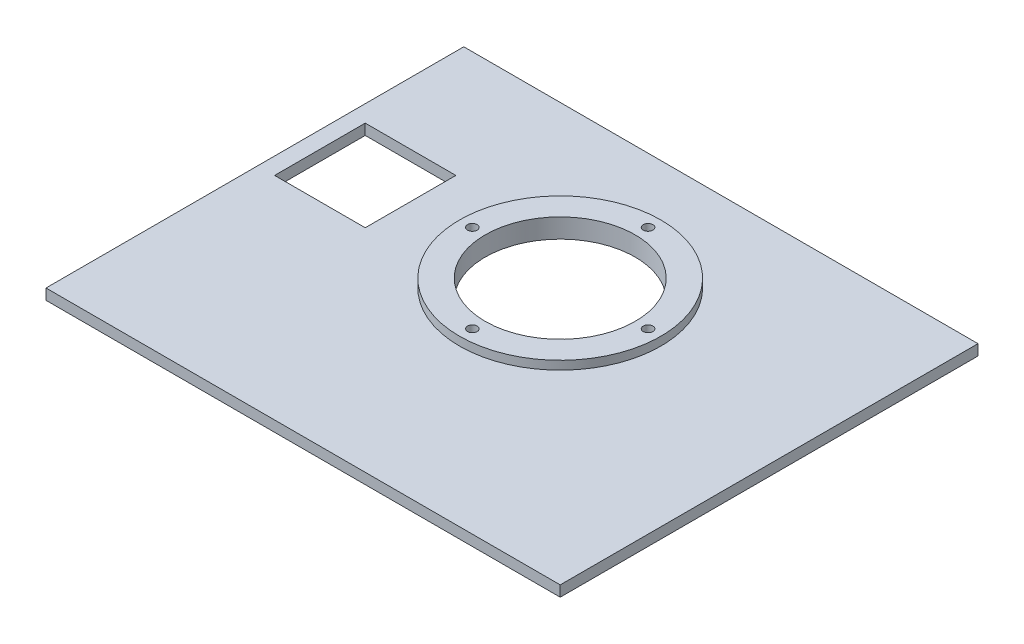
ISO-10303-21;
HEADER;
FILE_DESCRIPTION(('STEP AP214'),'2;1');
FILE_NAME('part.step','',(''),(''),'','','');
FILE_SCHEMA(('AUTOMOTIVE_DESIGN { 1 0 10303 214 1 1 1 1 }'));
ENDSEC;
DATA;
#1=APPLICATION_CONTEXT('core data for automotive mechanical design processes');
#2=APPLICATION_PROTOCOL_DEFINITION('international standard','automotive_design',2000,#1);
#3=PRODUCT_CONTEXT('',#1,'mechanical');
#4=PRODUCT('Part','Part','',(#3));
#5=PRODUCT_RELATED_PRODUCT_CATEGORY('part','',(#4));
#6=PRODUCT_DEFINITION_FORMATION('','',#4);
#7=PRODUCT_DEFINITION_CONTEXT('part definition',#1,'design');
#8=PRODUCT_DEFINITION('design','',#6,#7);
#9=PRODUCT_DEFINITION_SHAPE('','',#8);
#10=(LENGTH_UNIT() NAMED_UNIT(*) SI_UNIT(.MILLI.,.METRE.));
#11=(NAMED_UNIT(*) PLANE_ANGLE_UNIT() SI_UNIT($,.RADIAN.));
#12=(NAMED_UNIT(*) SI_UNIT($,.STERADIAN.) SOLID_ANGLE_UNIT());
#13=UNCERTAINTY_MEASURE_WITH_UNIT(LENGTH_MEASURE(1.E-05),#10,'distance_accuracy_value','');
#14=(GEOMETRIC_REPRESENTATION_CONTEXT(3) GLOBAL_UNCERTAINTY_ASSIGNED_CONTEXT((#13)) GLOBAL_UNIT_ASSIGNED_CONTEXT((#10,
#11,#12)) REPRESENTATION_CONTEXT('',''));
#15=CARTESIAN_POINT('',(0.,0.,0.));
#16=DIRECTION('',(0.,0.,1.));
#17=DIRECTION('',(1.,0.,0.));
#18=AXIS2_PLACEMENT_3D('',#15,#16,#17);
#19=CARTESIAN_POINT('',(0.,0.,0.));
#20=DIRECTION('',(0.,1.,0.));
#21=DIRECTION('',(0.,0.,1.));
#22=AXIS2_PLACEMENT_3D('',#19,#20,#21);
#23=PLANE('',#22);
#24=DIRECTION('',(1.,0.,0.));
#25=VECTOR('',#24,1.);
#26=CARTESIAN_POINT('',(0.,0.,21.15));
#27=LINE('',#26,#25);
#28=CARTESIAN_POINT('',(-112.15,0.,21.15));
#29=VERTEX_POINT('',#28);
#30=CARTESIAN_POINT('',(-69.85,0.,21.15));
#31=VERTEX_POINT('',#30);
#32=EDGE_CURVE('E134',#29,#31,#27,.T.);
#33=ORIENTED_EDGE('',*,*,#32,.T.);
#34=DIRECTION('',(0.,0.,-1.));
#35=VECTOR('',#34,1.);
#36=CARTESIAN_POINT('',(-69.85,0.,0.));
#37=LINE('',#36,#35);
#38=CARTESIAN_POINT('',(-69.85,0.,-21.15));
#39=VERTEX_POINT('',#38);
#40=EDGE_CURVE('E137',#31,#39,#37,.T.);
#41=ORIENTED_EDGE('',*,*,#40,.T.);
#42=DIRECTION('',(-1.,0.,0.));
#43=VECTOR('',#42,1.);
#44=CARTESIAN_POINT('',(0.,0.,-21.15));
#45=LINE('',#44,#43);
#46=CARTESIAN_POINT('',(-112.15,0.,-21.15));
#47=VERTEX_POINT('',#46);
#48=EDGE_CURVE('E129',#39,#47,#45,.T.);
#49=ORIENTED_EDGE('',*,*,#48,.T.);
#50=DIRECTION('',(0.,0.,1.));
#51=VECTOR('',#50,1.);
#52=CARTESIAN_POINT('',(-112.15,0.,0.));
#53=LINE('',#52,#51);
#54=EDGE_CURVE('E109',#47,#29,#53,.T.);
#55=ORIENTED_EDGE('',*,*,#54,.T.);
#56=EDGE_LOOP('',(#33,#41,#49,#55));
#57=FACE_BOUND('',#56,.T.);
#58=CARTESIAN_POINT('',(-41.,0.,0.));
#59=DIRECTION('',(0.,-1.,0.));
#60=DIRECTION('',(0.,0.,-1.));
#61=AXIS2_PLACEMENT_3D('',#58,#59,#60);
#62=CIRCLE('',#61,2.25);
#63=CARTESIAN_POINT('',(-41.,0.,-2.25));
#64=VERTEX_POINT('',#63);
#65=EDGE_CURVE('E143',#64,#64,#62,.T.);
#66=ORIENTED_EDGE('',*,*,#65,.F.);
#67=EDGE_LOOP('',(#66));
#68=FACE_BOUND('',#67,.T.);
#69=CARTESIAN_POINT('',(0.,0.,41.));
#70=DIRECTION('',(0.,-1.,0.));
#71=DIRECTION('',(0.,0.,-1.));
#72=AXIS2_PLACEMENT_3D('',#69,#70,#71);
#73=CIRCLE('',#72,2.25);
#74=CARTESIAN_POINT('',(0.,0.,38.75));
#75=VERTEX_POINT('',#74);
#76=EDGE_CURVE('E147',#75,#75,#73,.T.);
#77=ORIENTED_EDGE('',*,*,#76,.F.);
#78=EDGE_LOOP('',(#77));
#79=FACE_BOUND('',#78,.T.);
#80=CARTESIAN_POINT('',(41.,0.,0.));
#81=DIRECTION('',(0.,-1.,0.));
#82=DIRECTION('',(0.,0.,-1.));
#83=AXIS2_PLACEMENT_3D('',#80,#81,#82);
#84=CIRCLE('',#83,2.25);
#85=CARTESIAN_POINT('',(41.,0.,-2.25));
#86=VERTEX_POINT('',#85);
#87=EDGE_CURVE('E153',#86,#86,#84,.T.);
#88=ORIENTED_EDGE('',*,*,#87,.F.);
#89=EDGE_LOOP('',(#88));
#90=FACE_BOUND('',#89,.T.);
#91=DIRECTION('',(0.,0.,1.));
#92=VECTOR('',#91,1.);
#93=CARTESIAN_POINT('',(-120.,0.,-75.));
#94=LINE('',#93,#92);
#95=CARTESIAN_POINT('',(-120.,0.,-75.));
#96=VERTEX_POINT('',#95);
#97=CARTESIAN_POINT('',(-120.,0.,120.));
#98=VERTEX_POINT('',#97);
#99=EDGE_CURVE('E168',#96,#98,#94,.T.);
#100=ORIENTED_EDGE('',*,*,#99,.F.);
#101=DIRECTION('',(-1.,0.,0.));
#102=VECTOR('',#101,1.);
#103=CARTESIAN_POINT('',(-120.,0.,-75.));
#104=LINE('',#103,#102);
#105=CARTESIAN_POINT('',(120.,0.,-75.));
#106=VERTEX_POINT('',#105);
#107=EDGE_CURVE('E173',#106,#96,#104,.T.);
#108=ORIENTED_EDGE('',*,*,#107,.F.);
#109=DIRECTION('',(0.,0.,-1.));
#110=VECTOR('',#109,1.);
#111=CARTESIAN_POINT('',(120.,0.,120.));
#112=LINE('',#111,#110);
#113=CARTESIAN_POINT('',(120.,0.,120.));
#114=VERTEX_POINT('',#113);
#115=EDGE_CURVE('E184',#114,#106,#112,.T.);
#116=ORIENTED_EDGE('',*,*,#115,.F.);
#117=DIRECTION('',(1.,0.,0.));
#118=VECTOR('',#117,1.);
#119=CARTESIAN_POINT('',(-120.,0.,120.));
#120=LINE('',#119,#118);
#121=EDGE_CURVE('E182',#98,#114,#120,.T.);
#122=ORIENTED_EDGE('',*,*,#121,.F.);
#123=EDGE_LOOP('',(#100,#108,#116,#122));
#124=FACE_BOUND('',#123,.T.);
#125=CARTESIAN_POINT('',(0.,0.,0.));
#126=DIRECTION('',(0.,1.,0.));
#127=DIRECTION('',(0.,0.,1.));
#128=AXIS2_PLACEMENT_3D('',#125,#126,#127);
#129=CIRCLE('',#128,35.);
#130=CARTESIAN_POINT('',(0.,0.,35.));
#131=VERTEX_POINT('',#130);
#132=EDGE_CURVE('E164',#131,#131,#129,.T.);
#133=ORIENTED_EDGE('',*,*,#132,.T.);
#134=EDGE_LOOP('',(#133));
#135=FACE_BOUND('',#134,.T.);
#136=CARTESIAN_POINT('',(0.,0.,-41.));
#137=DIRECTION('',(0.,-1.,0.));
#138=DIRECTION('',(0.,0.,-1.));
#139=AXIS2_PLACEMENT_3D('',#136,#137,#138);
#140=CIRCLE('',#139,2.25);
#141=CARTESIAN_POINT('',(0.,0.,-43.25));
#142=VERTEX_POINT('',#141);
#143=EDGE_CURVE('E140',#142,#142,#140,.T.);
#144=ORIENTED_EDGE('',*,*,#143,.F.);
#145=EDGE_LOOP('',(#144));
#146=FACE_BOUND('',#145,.T.);
#147=ADVANCED_FACE('F36',(#57,#68,#79,#90,#124,#135,#146),#23,.F.);
#148=CARTESIAN_POINT('',(0.,5.,0.));
#149=DIRECTION('',(0.,1.,0.));
#150=DIRECTION('',(0.,0.,1.));
#151=AXIS2_PLACEMENT_3D('',#148,#149,#150);
#152=PLANE('',#151);
#153=DIRECTION('',(0.,0.,-1.));
#154=VECTOR('',#153,1.);
#155=CARTESIAN_POINT('',(-69.85,5.,21.15));
#156=LINE('',#155,#154);
#157=CARTESIAN_POINT('',(-69.85,5.,21.15));
#158=VERTEX_POINT('',#157);
#159=CARTESIAN_POINT('',(-69.85,5.,-21.15));
#160=VERTEX_POINT('',#159);
#161=EDGE_CURVE('E61',#158,#160,#156,.T.);
#162=ORIENTED_EDGE('',*,*,#161,.F.);
#163=DIRECTION('',(1.,0.,0.));
#164=VECTOR('',#163,1.);
#165=CARTESIAN_POINT('',(-69.85,5.,21.15));
#166=LINE('',#165,#164);
#167=CARTESIAN_POINT('',(-112.15,5.,21.15));
#168=VERTEX_POINT('',#167);
#169=EDGE_CURVE('E122',#168,#158,#166,.T.);
#170=ORIENTED_EDGE('',*,*,#169,.F.);
#171=DIRECTION('',(0.,0.,1.));
#172=VECTOR('',#171,1.);
#173=CARTESIAN_POINT('',(-112.15,5.,21.15));
#174=LINE('',#173,#172);
#175=CARTESIAN_POINT('',(-112.15,5.,-21.15));
#176=VERTEX_POINT('',#175);
#177=EDGE_CURVE('E106',#176,#168,#174,.T.);
#178=ORIENTED_EDGE('',*,*,#177,.F.);
#179=DIRECTION('',(-1.,0.,0.));
#180=VECTOR('',#179,1.);
#181=CARTESIAN_POINT('',(-69.85,5.,-21.15));
#182=LINE('',#181,#180);
#183=EDGE_CURVE('E115',#160,#176,#182,.T.);
#184=ORIENTED_EDGE('',*,*,#183,.F.);
#185=EDGE_LOOP('',(#162,#170,#178,#184));
#186=FACE_BOUND('',#185,.T.);
#187=CARTESIAN_POINT('',(0.,5.,0.));
#188=DIRECTION('',(0.,1.,0.));
#189=DIRECTION('',(0.,0.,1.));
#190=AXIS2_PLACEMENT_3D('',#187,#188,#189);
#191=CIRCLE('',#190,47.);
#192=CARTESIAN_POINT('',(0.,5.,47.));
#193=VERTEX_POINT('',#192);
#194=EDGE_CURVE('E11',#193,#193,#191,.T.);
#195=ORIENTED_EDGE('',*,*,#194,.F.);
#196=EDGE_LOOP('',(#195));
#197=FACE_BOUND('',#196,.T.);
#198=DIRECTION('',(0.,0.,1.));
#199=VECTOR('',#198,1.);
#200=CARTESIAN_POINT('',(-120.,5.,-75.));
#201=LINE('',#200,#199);
#202=CARTESIAN_POINT('',(-120.,5.,-75.));
#203=VERTEX_POINT('',#202);
#204=CARTESIAN_POINT('',(-120.,5.,120.));
#205=VERTEX_POINT('',#204);
#206=EDGE_CURVE('E169',#203,#205,#201,.T.);
#207=ORIENTED_EDGE('',*,*,#206,.T.);
#208=DIRECTION('',(1.,0.,0.));
#209=VECTOR('',#208,1.);
#210=CARTESIAN_POINT('',(-120.,5.,120.));
#211=LINE('',#210,#209);
#212=CARTESIAN_POINT('',(120.,5.,120.));
#213=VERTEX_POINT('',#212);
#214=EDGE_CURVE('E172',#205,#213,#211,.T.);
#215=ORIENTED_EDGE('',*,*,#214,.T.);
#216=DIRECTION('',(0.,0.,-1.));
#217=VECTOR('',#216,1.);
#218=CARTESIAN_POINT('',(120.,5.,120.));
#219=LINE('',#218,#217);
#220=CARTESIAN_POINT('',(120.,5.,-75.));
#221=VERTEX_POINT('',#220);
#222=EDGE_CURVE('E175',#213,#221,#219,.T.);
#223=ORIENTED_EDGE('',*,*,#222,.T.);
#224=DIRECTION('',(-1.,0.,0.));
#225=VECTOR('',#224,1.);
#226=CARTESIAN_POINT('',(-120.,5.,-75.));
#227=LINE('',#226,#225);
#228=EDGE_CURVE('E177',#221,#203,#227,.T.);
#229=ORIENTED_EDGE('',*,*,#228,.T.);
#230=EDGE_LOOP('',(#207,#215,#223,#229));
#231=FACE_BOUND('',#230,.T.);
#232=ADVANCED_FACE('F119',(#186,#197,#231),#152,.T.);
#233=CARTESIAN_POINT('',(-120.,5.,-75.));
#234=DIRECTION('',(1.,0.,0.));
#235=DIRECTION('',(0.,0.,-1.));
#236=AXIS2_PLACEMENT_3D('',#233,#234,#235);
#237=PLANE('',#236);
#238=ORIENTED_EDGE('',*,*,#99,.T.);
#239=DIRECTION('',(0.,-1.,0.));
#240=VECTOR('',#239,1.);
#241=CARTESIAN_POINT('',(-120.,5.,120.));
#242=LINE('',#241,#240);
#243=EDGE_CURVE('E45',#205,#98,#242,.T.);
#244=ORIENTED_EDGE('',*,*,#243,.F.);
#245=ORIENTED_EDGE('',*,*,#206,.F.);
#246=DIRECTION('',(0.,-1.,0.));
#247=VECTOR('',#246,1.);
#248=CARTESIAN_POINT('',(-120.,5.,-75.));
#249=LINE('',#248,#247);
#250=EDGE_CURVE('E179',#203,#96,#249,.T.);
#251=ORIENTED_EDGE('',*,*,#250,.T.);
#252=EDGE_LOOP('',(#238,#244,#245,#251));
#253=FACE_BOUND('',#252,.T.);
#254=ADVANCED_FACE('F38',(#253),#237,.F.);
#255=CARTESIAN_POINT('',(-120.,5.,120.));
#256=DIRECTION('',(0.,0.,-1.));
#257=DIRECTION('',(-1.,0.,0.));
#258=AXIS2_PLACEMENT_3D('',#255,#256,#257);
#259=PLANE('',#258);
#260=ORIENTED_EDGE('',*,*,#121,.T.);
#261=DIRECTION('',(0.,-1.,0.));
#262=VECTOR('',#261,1.);
#263=CARTESIAN_POINT('',(120.,5.,120.));
#264=LINE('',#263,#262);
#265=EDGE_CURVE('E192',#213,#114,#264,.T.);
#266=ORIENTED_EDGE('',*,*,#265,.F.);
#267=ORIENTED_EDGE('',*,*,#214,.F.);
#268=ORIENTED_EDGE('',*,*,#243,.T.);
#269=EDGE_LOOP('',(#260,#266,#267,#268));
#270=FACE_BOUND('',#269,.T.);
#271=ADVANCED_FACE('F239',(#270),#259,.F.);
#272=CARTESIAN_POINT('',(120.,5.,120.));
#273=DIRECTION('',(-1.,0.,0.));
#274=DIRECTION('',(0.,0.,1.));
#275=AXIS2_PLACEMENT_3D('',#272,#273,#274);
#276=PLANE('',#275);
#277=ORIENTED_EDGE('',*,*,#115,.T.);
#278=DIRECTION('',(0.,-1.,0.));
#279=VECTOR('',#278,1.);
#280=CARTESIAN_POINT('',(120.,5.,-75.));
#281=LINE('',#280,#279);
#282=EDGE_CURVE('E189',#221,#106,#281,.T.);
#283=ORIENTED_EDGE('',*,*,#282,.F.);
#284=ORIENTED_EDGE('',*,*,#222,.F.);
#285=ORIENTED_EDGE('',*,*,#265,.T.);
#286=EDGE_LOOP('',(#277,#283,#284,#285));
#287=FACE_BOUND('',#286,.T.);
#288=ADVANCED_FACE('F224',(#287),#276,.F.);
#289=CARTESIAN_POINT('',(-120.,5.,-75.));
#290=DIRECTION('',(0.,0.,1.));
#291=DIRECTION('',(1.,0.,0.));
#292=AXIS2_PLACEMENT_3D('',#289,#290,#291);
#293=PLANE('',#292);
#294=ORIENTED_EDGE('',*,*,#107,.T.);
#295=ORIENTED_EDGE('',*,*,#250,.F.);
#296=ORIENTED_EDGE('',*,*,#228,.F.);
#297=ORIENTED_EDGE('',*,*,#282,.T.);
#298=EDGE_LOOP('',(#294,#295,#296,#297));
#299=FACE_BOUND('',#298,.T.);
#300=ADVANCED_FACE('F218',(#299),#293,.F.);
#301=CARTESIAN_POINT('',(0.,5.,0.));
#302=DIRECTION('',(0.,-1.,0.));
#303=DIRECTION('',(0.,0.,-1.));
#304=AXIS2_PLACEMENT_3D('',#301,#302,#303);
#305=CYLINDRICAL_SURFACE('',#304,35.);
#306=ORIENTED_EDGE('',*,*,#132,.F.);
#307=EDGE_LOOP('',(#306));
#308=FACE_BOUND('',#307,.T.);
#309=CARTESIAN_POINT('',(0.,9.,0.));
#310=DIRECTION('',(0.,1.,0.));
#311=DIRECTION('',(0.,0.,1.));
#312=AXIS2_PLACEMENT_3D('',#309,#310,#311);
#313=CIRCLE('',#312,35.);
#314=CARTESIAN_POINT('',(0.,9.,35.));
#315=VERTEX_POINT('',#314);
#316=EDGE_CURVE('E159',#315,#315,#313,.T.);
#317=ORIENTED_EDGE('',*,*,#316,.T.);
#318=EDGE_LOOP('',(#317));
#319=FACE_BOUND('',#318,.T.);
#320=ADVANCED_FACE('F206',(#308,#319),#305,.F.);
#321=CARTESIAN_POINT('',(0.,9.,0.));
#322=DIRECTION('',(0.,1.,0.));
#323=DIRECTION('',(0.,0.,1.));
#324=AXIS2_PLACEMENT_3D('',#321,#322,#323);
#325=PLANE('',#324);
#326=CARTESIAN_POINT('',(0.,9.,-41.));
#327=DIRECTION('',(0.,1.,0.));
#328=DIRECTION('',(0.,0.,1.));
#329=AXIS2_PLACEMENT_3D('',#326,#327,#328);
#330=CIRCLE('',#329,2.25);
#331=CARTESIAN_POINT('',(0.,9.,-38.75));
#332=VERTEX_POINT('',#331);
#333=EDGE_CURVE('E40',#332,#332,#330,.T.);
#334=ORIENTED_EDGE('',*,*,#333,.F.);
#335=EDGE_LOOP('',(#334));
#336=FACE_BOUND('',#335,.T.);
#337=CARTESIAN_POINT('',(-41.,9.,0.));
#338=DIRECTION('',(0.,1.,0.));
#339=DIRECTION('',(0.,0.,1.));
#340=AXIS2_PLACEMENT_3D('',#337,#338,#339);
#341=CIRCLE('',#340,2.25);
#342=CARTESIAN_POINT('',(-41.,9.,2.25));
#343=VERTEX_POINT('',#342);
#344=EDGE_CURVE('E146',#343,#343,#341,.T.);
#345=ORIENTED_EDGE('',*,*,#344,.F.);
#346=EDGE_LOOP('',(#345));
#347=FACE_BOUND('',#346,.T.);
#348=CARTESIAN_POINT('',(0.,9.,41.));
#349=DIRECTION('',(0.,1.,0.));
#350=DIRECTION('',(0.,0.,1.));
#351=AXIS2_PLACEMENT_3D('',#348,#349,#350);
#352=CIRCLE('',#351,2.25);
#353=CARTESIAN_POINT('',(0.,9.,43.25));
#354=VERTEX_POINT('',#353);
#355=EDGE_CURVE('E150',#354,#354,#352,.T.);
#356=ORIENTED_EDGE('',*,*,#355,.F.);
#357=EDGE_LOOP('',(#356));
#358=FACE_BOUND('',#357,.T.);
#359=CARTESIAN_POINT('',(41.,9.,0.));
#360=DIRECTION('',(0.,1.,0.));
#361=DIRECTION('',(0.,0.,1.));
#362=AXIS2_PLACEMENT_3D('',#359,#360,#361);
#363=CIRCLE('',#362,2.25);
#364=CARTESIAN_POINT('',(41.,9.,2.25));
#365=VERTEX_POINT('',#364);
#366=EDGE_CURVE('E156',#365,#365,#363,.T.);
#367=ORIENTED_EDGE('',*,*,#366,.F.);
#368=EDGE_LOOP('',(#367));
#369=FACE_BOUND('',#368,.T.);
#370=CARTESIAN_POINT('',(0.,9.,0.));
#371=DIRECTION('',(0.,1.,0.));
#372=DIRECTION('',(0.,0.,1.));
#373=AXIS2_PLACEMENT_3D('',#370,#371,#372);
#374=CIRCLE('',#373,47.);
#375=CARTESIAN_POINT('',(0.,9.,47.));
#376=VERTEX_POINT('',#375);
#377=EDGE_CURVE('E162',#376,#376,#374,.T.);
#378=ORIENTED_EDGE('',*,*,#377,.T.);
#379=EDGE_LOOP('',(#378));
#380=FACE_BOUND('',#379,.T.);
#381=ORIENTED_EDGE('',*,*,#316,.F.);
#382=EDGE_LOOP('',(#381));
#383=FACE_BOUND('',#382,.T.);
#384=ADVANCED_FACE('F202',(#336,#347,#358,#369,#380,#383),#325,.T.);
#385=CARTESIAN_POINT('',(0.,9.,0.));
#386=DIRECTION('',(0.,-1.,0.));
#387=DIRECTION('',(0.,0.,-1.));
#388=AXIS2_PLACEMENT_3D('',#385,#386,#387);
#389=CYLINDRICAL_SURFACE('',#388,47.);
#390=ORIENTED_EDGE('',*,*,#377,.F.);
#391=EDGE_LOOP('',(#390));
#392=FACE_BOUND('',#391,.T.);
#393=ORIENTED_EDGE('',*,*,#194,.T.);
#394=EDGE_LOOP('',(#393));
#395=FACE_BOUND('',#394,.T.);
#396=ADVANCED_FACE('F205',(#392,#395),#389,.T.);
#397=CARTESIAN_POINT('',(41.,0.,0.));
#398=DIRECTION('',(0.,-1.,0.));
#399=DIRECTION('',(0.,0.,-1.));
#400=AXIS2_PLACEMENT_3D('',#397,#398,#399);
#401=CYLINDRICAL_SURFACE('',#400,2.25);
#402=ORIENTED_EDGE('',*,*,#366,.T.);
#403=EDGE_LOOP('',(#402));
#404=FACE_BOUND('',#403,.T.);
#405=ORIENTED_EDGE('',*,*,#87,.T.);
#406=EDGE_LOOP('',(#405));
#407=FACE_BOUND('',#406,.T.);
#408=ADVANCED_FACE('F281',(#404,#407),#401,.F.);
#409=CARTESIAN_POINT('',(0.,0.,41.));
#410=DIRECTION('',(0.,-1.,0.));
#411=DIRECTION('',(0.,0.,-1.));
#412=AXIS2_PLACEMENT_3D('',#409,#410,#411);
#413=CYLINDRICAL_SURFACE('',#412,2.25);
#414=ORIENTED_EDGE('',*,*,#355,.T.);
#415=EDGE_LOOP('',(#414));
#416=FACE_BOUND('',#415,.T.);
#417=ORIENTED_EDGE('',*,*,#76,.T.);
#418=EDGE_LOOP('',(#417));
#419=FACE_BOUND('',#418,.T.);
#420=ADVANCED_FACE('F274',(#416,#419),#413,.F.);
#421=CARTESIAN_POINT('',(-41.,0.,0.));
#422=DIRECTION('',(0.,-1.,0.));
#423=DIRECTION('',(0.,0.,-1.));
#424=AXIS2_PLACEMENT_3D('',#421,#422,#423);
#425=CYLINDRICAL_SURFACE('',#424,2.25);
#426=ORIENTED_EDGE('',*,*,#344,.T.);
#427=EDGE_LOOP('',(#426));
#428=FACE_BOUND('',#427,.T.);
#429=ORIENTED_EDGE('',*,*,#65,.T.);
#430=EDGE_LOOP('',(#429));
#431=FACE_BOUND('',#430,.T.);
#432=ADVANCED_FACE('F199',(#428,#431),#425,.F.);
#433=CARTESIAN_POINT('',(0.,0.,-41.));
#434=DIRECTION('',(0.,-1.,0.));
#435=DIRECTION('',(0.,0.,-1.));
#436=AXIS2_PLACEMENT_3D('',#433,#434,#435);
#437=CYLINDRICAL_SURFACE('',#436,2.25);
#438=ORIENTED_EDGE('',*,*,#333,.T.);
#439=EDGE_LOOP('',(#438));
#440=FACE_BOUND('',#439,.T.);
#441=ORIENTED_EDGE('',*,*,#143,.T.);
#442=EDGE_LOOP('',(#441));
#443=FACE_BOUND('',#442,.T.);
#444=ADVANCED_FACE('F263',(#440,#443),#437,.F.);
#445=CARTESIAN_POINT('',(-69.85,-9.,21.15));
#446=DIRECTION('',(1.,0.,0.));
#447=DIRECTION('',(0.,0.,-1.));
#448=AXIS2_PLACEMENT_3D('',#445,#446,#447);
#449=PLANE('',#448);
#450=DIRECTION('',(0.,1.,0.));
#451=VECTOR('',#450,1.);
#452=CARTESIAN_POINT('',(-69.85,-9.,21.15));
#453=LINE('',#452,#451);
#454=EDGE_CURVE('E127',#31,#158,#453,.T.);
#455=ORIENTED_EDGE('',*,*,#454,.T.);
#456=ORIENTED_EDGE('',*,*,#161,.T.);
#457=DIRECTION('',(0.,1.,0.));
#458=VECTOR('',#457,1.);
#459=CARTESIAN_POINT('',(-69.85,-9.,-21.15));
#460=LINE('',#459,#458);
#461=EDGE_CURVE('E112',#39,#160,#460,.T.);
#462=ORIENTED_EDGE('',*,*,#461,.F.);
#463=ORIENTED_EDGE('',*,*,#40,.F.);
#464=EDGE_LOOP('',(#455,#456,#462,#463));
#465=FACE_BOUND('',#464,.T.);
#466=ADVANCED_FACE('F265',(#465),#449,.F.);
#467=CARTESIAN_POINT('',(-69.85,-9.,21.15));
#468=DIRECTION('',(0.,0.,1.));
#469=DIRECTION('',(1.,0.,0.));
#470=AXIS2_PLACEMENT_3D('',#467,#468,#469);
#471=PLANE('',#470);
#472=DIRECTION('',(0.,1.,0.));
#473=VECTOR('',#472,1.);
#474=CARTESIAN_POINT('',(-112.15,-9.,21.15));
#475=LINE('',#474,#473);
#476=EDGE_CURVE('E111',#29,#168,#475,.T.);
#477=ORIENTED_EDGE('',*,*,#476,.T.);
#478=ORIENTED_EDGE('',*,*,#169,.T.);
#479=ORIENTED_EDGE('',*,*,#454,.F.);
#480=ORIENTED_EDGE('',*,*,#32,.F.);
#481=EDGE_LOOP('',(#477,#478,#479,#480));
#482=FACE_BOUND('',#481,.T.);
#483=ADVANCED_FACE('F272',(#482),#471,.F.);
#484=CARTESIAN_POINT('',(-112.15,-9.,21.15));
#485=DIRECTION('',(-1.,0.,0.));
#486=DIRECTION('',(0.,0.,1.));
#487=AXIS2_PLACEMENT_3D('',#484,#485,#486);
#488=PLANE('',#487);
#489=DIRECTION('',(0.,1.,0.));
#490=VECTOR('',#489,1.);
#491=CARTESIAN_POINT('',(-112.15,-9.,-21.15));
#492=LINE('',#491,#490);
#493=EDGE_CURVE('E53',#47,#176,#492,.T.);
#494=ORIENTED_EDGE('',*,*,#493,.T.);
#495=ORIENTED_EDGE('',*,*,#177,.T.);
#496=ORIENTED_EDGE('',*,*,#476,.F.);
#497=ORIENTED_EDGE('',*,*,#54,.F.);
#498=EDGE_LOOP('',(#494,#495,#496,#497));
#499=FACE_BOUND('',#498,.T.);
#500=ADVANCED_FACE('F103',(#499),#488,.F.);
#501=CARTESIAN_POINT('',(-69.85,-9.,-21.15));
#502=DIRECTION('',(0.,0.,-1.));
#503=DIRECTION('',(-1.,0.,0.));
#504=AXIS2_PLACEMENT_3D('',#501,#502,#503);
#505=PLANE('',#504);
#506=ORIENTED_EDGE('',*,*,#461,.T.);
#507=ORIENTED_EDGE('',*,*,#183,.T.);
#508=ORIENTED_EDGE('',*,*,#493,.F.);
#509=ORIENTED_EDGE('',*,*,#48,.F.);
#510=EDGE_LOOP('',(#506,#507,#508,#509));
#511=FACE_BOUND('',#510,.T.);
#512=ADVANCED_FACE('F116',(#511),#505,.F.);
#513=CLOSED_SHELL('',(#147,#232,#254,#271,#288,#300,#320,#384,#396,#408,#420,#432,#444,#466,
#483,#500,#512));
#514=MANIFOLD_SOLID_BREP('B2',#513);
#515=ADVANCED_BREP_SHAPE_REPRESENTATION('',(#18,#514),#14);
#516=SHAPE_DEFINITION_REPRESENTATION(#9,#515);
ENDSEC;
END-ISO-10303-21;
